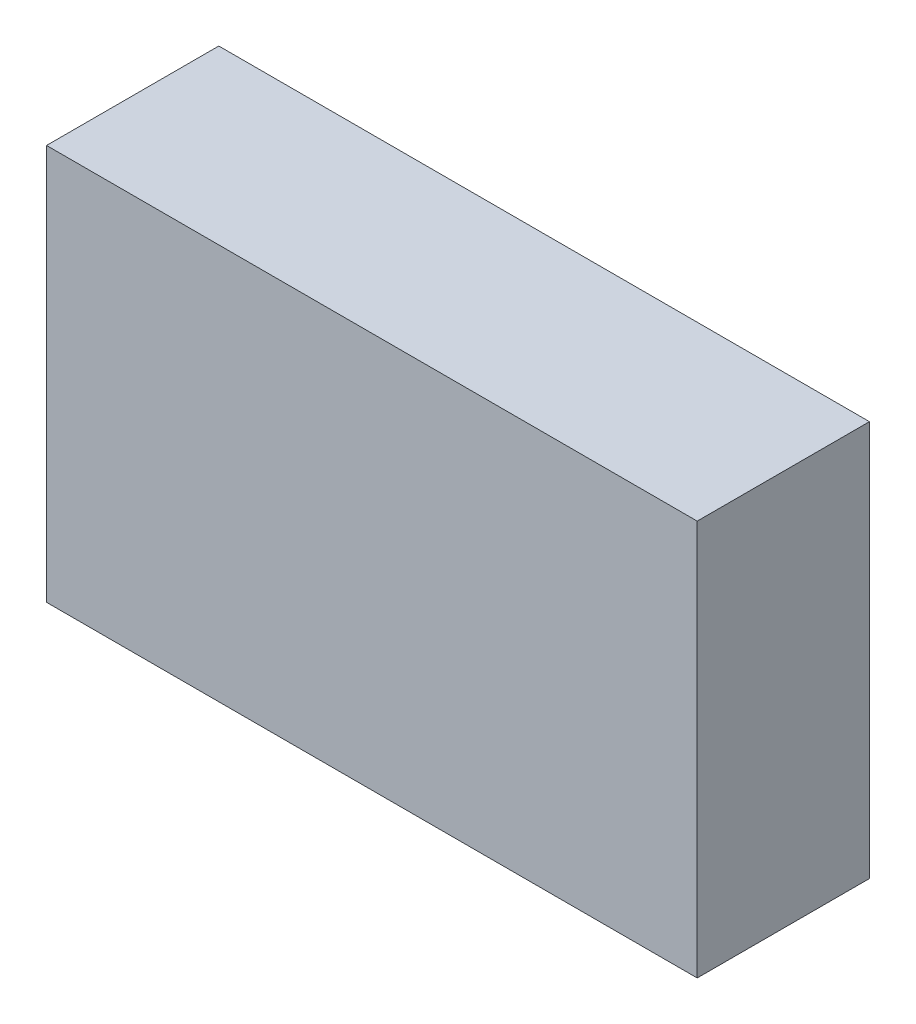
ISO-10303-21;
HEADER;
FILE_DESCRIPTION(('STEP AP214'),'2;1');
FILE_NAME('part.step','',(''),(''),'','','');
FILE_SCHEMA(('AUTOMOTIVE_DESIGN { 1 0 10303 214 1 1 1 1 }'));
ENDSEC;
DATA;
#1=APPLICATION_CONTEXT('core data for automotive mechanical design processes');
#2=APPLICATION_PROTOCOL_DEFINITION('international standard','automotive_design',2000,#1);
#3=PRODUCT_CONTEXT('',#1,'mechanical');
#4=PRODUCT('Part','Part','',(#3));
#5=PRODUCT_RELATED_PRODUCT_CATEGORY('part','',(#4));
#6=PRODUCT_DEFINITION_FORMATION('','',#4);
#7=PRODUCT_DEFINITION_CONTEXT('part definition',#1,'design');
#8=PRODUCT_DEFINITION('design','',#6,#7);
#9=PRODUCT_DEFINITION_SHAPE('','',#8);
#10=(LENGTH_UNIT() NAMED_UNIT(*) SI_UNIT(.MILLI.,.METRE.));
#11=(NAMED_UNIT(*) PLANE_ANGLE_UNIT() SI_UNIT($,.RADIAN.));
#12=(NAMED_UNIT(*) SI_UNIT($,.STERADIAN.) SOLID_ANGLE_UNIT());
#13=UNCERTAINTY_MEASURE_WITH_UNIT(LENGTH_MEASURE(1.E-05),#10,'distance_accuracy_value','');
#14=(GEOMETRIC_REPRESENTATION_CONTEXT(3) GLOBAL_UNCERTAINTY_ASSIGNED_CONTEXT((#13)) GLOBAL_UNIT_ASSIGNED_CONTEXT((#10,
#11,#12)) REPRESENTATION_CONTEXT('',''));
#15=CARTESIAN_POINT('',(0.,0.,0.));
#16=DIRECTION('',(0.,0.,1.));
#17=DIRECTION('',(1.,0.,0.));
#18=AXIS2_PLACEMENT_3D('',#15,#16,#17);
#19=CARTESIAN_POINT('',(-21.9595,2.3135,7.713));
#20=DIRECTION('',(1.,0.,0.));
#21=DIRECTION('',(0.,0.,-1.));
#22=AXIS2_PLACEMENT_3D('',#19,#20,#21);
#23=PLANE('',#22);
#24=DIRECTION('',(0.,-1.,0.));
#25=VECTOR('',#24,1.);
#26=CARTESIAN_POINT('',(-21.9595,2.3135,0.));
#27=LINE('',#26,#25);
#28=CARTESIAN_POINT('',(-21.9595,20.0325,0.));
#29=VERTEX_POINT('',#28);
#30=CARTESIAN_POINT('',(-21.9595,2.3135,0.));
#31=VERTEX_POINT('',#30);
#32=EDGE_CURVE('E101',#29,#31,#27,.T.);
#33=ORIENTED_EDGE('',*,*,#32,.T.);
#34=DIRECTION('',(0.,0.,-1.));
#35=VECTOR('',#34,1.);
#36=CARTESIAN_POINT('',(-21.9595,2.3135,7.713));
#37=LINE('',#36,#35);
#38=CARTESIAN_POINT('',(-21.9595,2.3135,7.713));
#39=VERTEX_POINT('',#38);
#40=EDGE_CURVE('E11',#39,#31,#37,.T.);
#41=ORIENTED_EDGE('',*,*,#40,.F.);
#42=DIRECTION('',(0.,-1.,0.));
#43=VECTOR('',#42,1.);
#44=CARTESIAN_POINT('',(-21.9595,2.3135,7.713));
#45=LINE('',#44,#43);
#46=CARTESIAN_POINT('',(-21.9595,20.0325,7.713));
#47=VERTEX_POINT('',#46);
#48=EDGE_CURVE('E95',#47,#39,#45,.T.);
#49=ORIENTED_EDGE('',*,*,#48,.F.);
#50=DIRECTION('',(0.,0.,-1.));
#51=VECTOR('',#50,1.);
#52=CARTESIAN_POINT('',(-21.9595,20.0325,7.713));
#53=LINE('',#52,#51);
#54=EDGE_CURVE('E99',#47,#29,#53,.T.);
#55=ORIENTED_EDGE('',*,*,#54,.T.);
#56=EDGE_LOOP('',(#33,#41,#49,#55));
#57=FACE_BOUND('',#56,.T.);
#58=ADVANCED_FACE('F41',(#57),#23,.F.);
#59=CARTESIAN_POINT('',(-21.9595,2.3135,7.713));
#60=DIRECTION('',(0.,1.,0.));
#61=DIRECTION('',(0.,0.,1.));
#62=AXIS2_PLACEMENT_3D('',#59,#60,#61);
#63=PLANE('',#62);
#64=DIRECTION('',(1.,0.,0.));
#65=VECTOR('',#64,1.);
#66=CARTESIAN_POINT('',(-21.9595,2.3135,0.));
#67=LINE('',#66,#65);
#68=CARTESIAN_POINT('',(7.1775,2.3135,0.));
#69=VERTEX_POINT('',#68);
#70=EDGE_CURVE('E96',#31,#69,#67,.T.);
#71=ORIENTED_EDGE('',*,*,#70,.T.);
#72=DIRECTION('',(0.,0.,-1.));
#73=VECTOR('',#72,1.);
#74=CARTESIAN_POINT('',(7.1775,2.3135,7.713));
#75=LINE('',#74,#73);
#76=CARTESIAN_POINT('',(7.1775,2.3135,7.713));
#77=VERTEX_POINT('',#76);
#78=EDGE_CURVE('E47',#77,#69,#75,.T.);
#79=ORIENTED_EDGE('',*,*,#78,.F.);
#80=DIRECTION('',(1.,0.,0.));
#81=VECTOR('',#80,1.);
#82=CARTESIAN_POINT('',(-21.9595,2.3135,7.713));
#83=LINE('',#82,#81);
#84=EDGE_CURVE('E90',#39,#77,#83,.T.);
#85=ORIENTED_EDGE('',*,*,#84,.F.);
#86=ORIENTED_EDGE('',*,*,#40,.T.);
#87=EDGE_LOOP('',(#71,#79,#85,#86));
#88=FACE_BOUND('',#87,.T.);
#89=ADVANCED_FACE('F94',(#88),#63,.F.);
#90=CARTESIAN_POINT('',(7.1775,2.3135,7.713));
#91=DIRECTION('',(-1.,0.,0.));
#92=DIRECTION('',(0.,0.,1.));
#93=AXIS2_PLACEMENT_3D('',#90,#91,#92);
#94=PLANE('',#93);
#95=DIRECTION('',(0.,1.,0.));
#96=VECTOR('',#95,1.);
#97=CARTESIAN_POINT('',(7.1775,2.3135,0.));
#98=LINE('',#97,#96);
#99=CARTESIAN_POINT('',(7.1775,20.0325,0.));
#100=VERTEX_POINT('',#99);
#101=EDGE_CURVE('E71',#69,#100,#98,.T.);
#102=ORIENTED_EDGE('',*,*,#101,.T.);
#103=DIRECTION('',(0.,0.,-1.));
#104=VECTOR('',#103,1.);
#105=CARTESIAN_POINT('',(7.1775,20.0325,7.713));
#106=LINE('',#105,#104);
#107=CARTESIAN_POINT('',(7.1775,20.0325,7.713));
#108=VERTEX_POINT('',#107);
#109=EDGE_CURVE('E100',#108,#100,#106,.T.);
#110=ORIENTED_EDGE('',*,*,#109,.F.);
#111=DIRECTION('',(0.,1.,0.));
#112=VECTOR('',#111,1.);
#113=CARTESIAN_POINT('',(7.1775,2.3135,7.713));
#114=LINE('',#113,#112);
#115=EDGE_CURVE('E89',#77,#108,#114,.T.);
#116=ORIENTED_EDGE('',*,*,#115,.F.);
#117=ORIENTED_EDGE('',*,*,#78,.T.);
#118=EDGE_LOOP('',(#102,#110,#116,#117));
#119=FACE_BOUND('',#118,.T.);
#120=ADVANCED_FACE('F97',(#119),#94,.F.);
#121=CARTESIAN_POINT('',(-21.9595,20.0325,7.713));
#122=DIRECTION('',(0.,-1.,0.));
#123=DIRECTION('',(0.,0.,-1.));
#124=AXIS2_PLACEMENT_3D('',#121,#122,#123);
#125=PLANE('',#124);
#126=DIRECTION('',(-1.,0.,0.));
#127=VECTOR('',#126,1.);
#128=CARTESIAN_POINT('',(-21.9595,20.0325,0.));
#129=LINE('',#128,#127);
#130=EDGE_CURVE('E79',#100,#29,#129,.T.);
#131=ORIENTED_EDGE('',*,*,#130,.T.);
#132=ORIENTED_EDGE('',*,*,#54,.F.);
#133=DIRECTION('',(-1.,0.,0.));
#134=VECTOR('',#133,1.);
#135=CARTESIAN_POINT('',(-21.9595,20.0325,7.713));
#136=LINE('',#135,#134);
#137=EDGE_CURVE('E60',#108,#47,#136,.T.);
#138=ORIENTED_EDGE('',*,*,#137,.F.);
#139=ORIENTED_EDGE('',*,*,#109,.T.);
#140=EDGE_LOOP('',(#131,#132,#138,#139));
#141=FACE_BOUND('',#140,.T.);
#142=ADVANCED_FACE('F112',(#141),#125,.F.);
#143=CARTESIAN_POINT('',(0.,0.,7.713));
#144=DIRECTION('',(0.,0.,-1.));
#145=DIRECTION('',(-1.,0.,0.));
#146=AXIS2_PLACEMENT_3D('',#143,#144,#145);
#147=PLANE('',#146);
#148=ORIENTED_EDGE('',*,*,#48,.T.);
#149=ORIENTED_EDGE('',*,*,#84,.T.);
#150=ORIENTED_EDGE('',*,*,#115,.T.);
#151=ORIENTED_EDGE('',*,*,#137,.T.);
#152=EDGE_LOOP('',(#148,#149,#150,#151));
#153=FACE_BOUND('',#152,.T.);
#154=ADVANCED_FACE('F88',(#153),#147,.F.);
#155=CARTESIAN_POINT('',(0.,0.,0.));
#156=DIRECTION('',(0.,0.,-1.));
#157=DIRECTION('',(-1.,0.,0.));
#158=AXIS2_PLACEMENT_3D('',#155,#156,#157);
#159=PLANE('',#158);
#160=ORIENTED_EDGE('',*,*,#32,.F.);
#161=ORIENTED_EDGE('',*,*,#130,.F.);
#162=ORIENTED_EDGE('',*,*,#101,.F.);
#163=ORIENTED_EDGE('',*,*,#70,.F.);
#164=EDGE_LOOP('',(#160,#161,#162,#163));
#165=FACE_BOUND('',#164,.T.);
#166=ADVANCED_FACE('F114',(#165),#159,.T.);
#167=CLOSED_SHELL('',(#58,#89,#120,#142,#154,#166));
#168=MANIFOLD_SOLID_BREP('B2',#167);
#169=ADVANCED_BREP_SHAPE_REPRESENTATION('',(#18,#168),#14);
#170=SHAPE_DEFINITION_REPRESENTATION(#9,#169);
ENDSEC;
END-ISO-10303-21;
